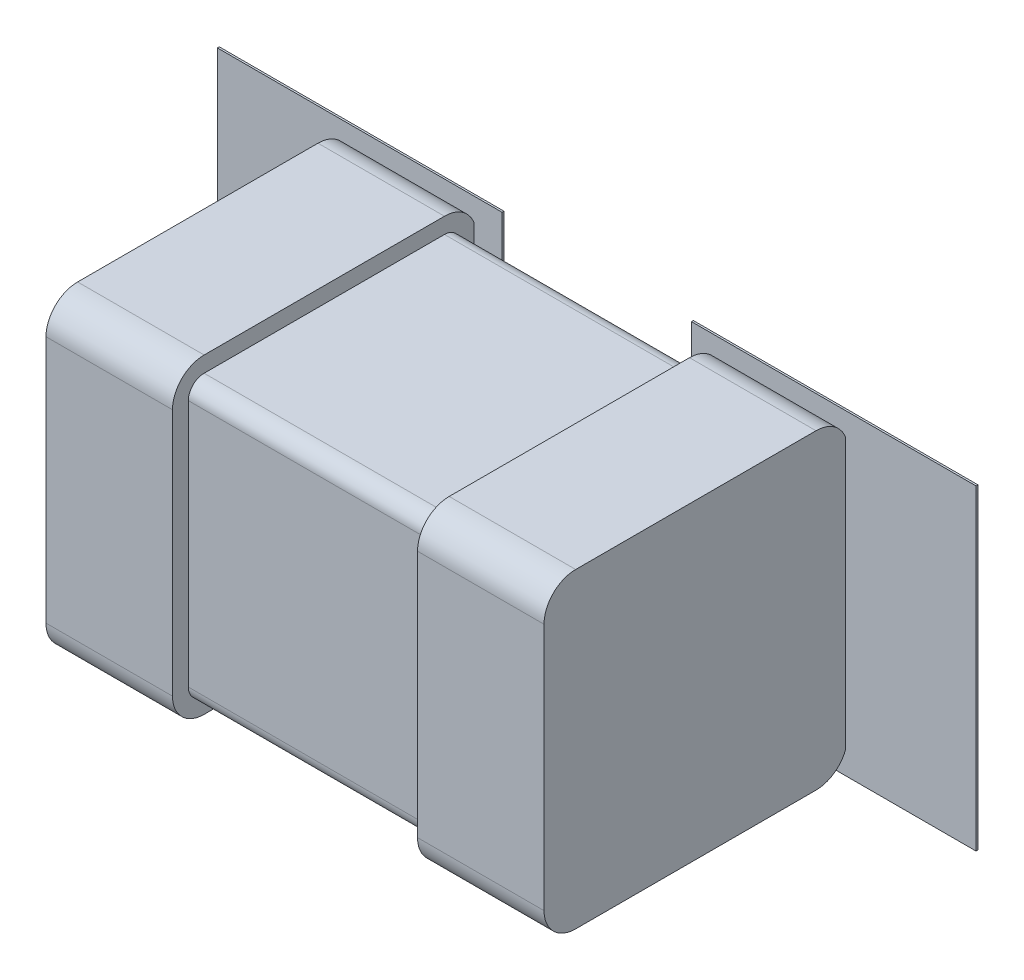
ISO-10303-21;
HEADER;
FILE_DESCRIPTION(('STEP AP214'),'2;1');
FILE_NAME('part.step','',(''),(''),'','','');
FILE_SCHEMA(('AUTOMOTIVE_DESIGN { 1 0 10303 214 1 1 1 1 }'));
ENDSEC;
DATA;
#1=APPLICATION_CONTEXT('core data for automotive mechanical design processes');
#2=APPLICATION_PROTOCOL_DEFINITION('international standard','automotive_design',2000,#1);
#3=PRODUCT_CONTEXT('',#1,'mechanical');
#4=PRODUCT('Part','Part','',(#3));
#5=PRODUCT_RELATED_PRODUCT_CATEGORY('part','',(#4));
#6=PRODUCT_DEFINITION_FORMATION('','',#4);
#7=PRODUCT_DEFINITION_CONTEXT('part definition',#1,'design');
#8=PRODUCT_DEFINITION('design','',#6,#7);
#9=PRODUCT_DEFINITION_SHAPE('','',#8);
#10=(LENGTH_UNIT() NAMED_UNIT(*) SI_UNIT(.MILLI.,.METRE.));
#11=(NAMED_UNIT(*) PLANE_ANGLE_UNIT() SI_UNIT($,.RADIAN.));
#12=(NAMED_UNIT(*) SI_UNIT($,.STERADIAN.) SOLID_ANGLE_UNIT());
#13=UNCERTAINTY_MEASURE_WITH_UNIT(LENGTH_MEASURE(1.E-05),#10,'distance_accuracy_value','');
#14=(GEOMETRIC_REPRESENTATION_CONTEXT(3) GLOBAL_UNCERTAINTY_ASSIGNED_CONTEXT((#13)) GLOBAL_UNIT_ASSIGNED_CONTEXT((#10,
#11,#12)) REPRESENTATION_CONTEXT('',''));
#15=CARTESIAN_POINT('',(0.,0.,0.));
#16=DIRECTION('',(0.,0.,1.));
#17=DIRECTION('',(1.,0.,0.));
#18=AXIS2_PLACEMENT_3D('',#15,#16,#17);
#19=CARTESIAN_POINT('',(0.,0.,0.0762));
#20=DIRECTION('',(0.,0.,1.));
#21=DIRECTION('',(1.,0.,0.));
#22=AXIS2_PLACEMENT_3D('',#19,#20,#21);
#23=PLANE('',#22);
#24=DIRECTION('',(0.,1.,0.));
#25=VECTOR('',#24,1.);
#26=CARTESIAN_POINT('',(0.380492,0.635,0.0762));
#27=LINE('',#26,#25);
#28=CARTESIAN_POINT('',(0.380492,0.635,0.0762));
#29=VERTEX_POINT('',#28);
#30=CARTESIAN_POINT('',(0.380492,-0.635,0.0762));
#31=VERTEX_POINT('',#30);
#32=EDGE_CURVE('E228',#29,#31,#27,.F.);
#33=ORIENTED_EDGE('',*,*,#32,.F.);
#34=DIRECTION('',(1.,0.,0.));
#35=VECTOR('',#34,1.);
#36=CARTESIAN_POINT('',(1.523492,0.635,0.0762));
#37=LINE('',#36,#35);
#38=CARTESIAN_POINT('',(1.523492,0.635,0.0762));
#39=VERTEX_POINT('',#38);
#40=EDGE_CURVE('E215',#39,#29,#37,.F.);
#41=ORIENTED_EDGE('',*,*,#40,.F.);
#42=DIRECTION('',(0.,1.,0.));
#43=VECTOR('',#42,1.);
#44=CARTESIAN_POINT('',(1.523492,-0.635,0.0762));
#45=LINE('',#44,#43);
#46=CARTESIAN_POINT('',(1.523492,-0.635,0.0762));
#47=VERTEX_POINT('',#46);
#48=EDGE_CURVE('E356',#47,#39,#45,.T.);
#49=ORIENTED_EDGE('',*,*,#48,.F.);
#50=DIRECTION('',(1.,0.,0.));
#51=VECTOR('',#50,1.);
#52=CARTESIAN_POINT('',(0.380492,-0.635,0.0762));
#53=LINE('',#52,#51);
#54=EDGE_CURVE('E229',#31,#47,#53,.T.);
#55=ORIENTED_EDGE('',*,*,#54,.F.);
#56=EDGE_LOOP('',(#33,#41,#49,#55));
#57=FACE_BOUND('',#56,.T.);
#58=ADVANCED_FACE('F16',(#57),#23,.F.);
#59=CARTESIAN_POINT('',(1.523492,0.635,0.0762));
#60=DIRECTION('',(0.,1.,0.));
#61=DIRECTION('',(0.,0.,1.));
#62=AXIS2_PLACEMENT_3D('',#59,#60,#61);
#63=PLANE('',#62);
#64=DIRECTION('',(0.,0.,-1.));
#65=VECTOR('',#64,1.);
#66=CARTESIAN_POINT('',(1.523492,0.635,0.0762));
#67=LINE('',#66,#65);
#68=CARTESIAN_POINT('',(1.523492,0.635,0.08382));
#69=VERTEX_POINT('',#68);
#70=EDGE_CURVE('E222',#39,#69,#67,.F.);
#71=ORIENTED_EDGE('',*,*,#70,.F.);
#72=ORIENTED_EDGE('',*,*,#40,.T.);
#73=DIRECTION('',(0.,0.,1.));
#74=VECTOR('',#73,1.);
#75=CARTESIAN_POINT('',(0.380492,0.635,0.0762));
#76=LINE('',#75,#74);
#77=CARTESIAN_POINT('',(0.380492,0.635,0.08382));
#78=VERTEX_POINT('',#77);
#79=EDGE_CURVE('E219',#78,#29,#76,.F.);
#80=ORIENTED_EDGE('',*,*,#79,.F.);
#81=DIRECTION('',(1.,0.,0.));
#82=VECTOR('',#81,1.);
#83=CARTESIAN_POINT('',(0.,0.635,0.08382));
#84=LINE('',#83,#82);
#85=EDGE_CURVE('E354',#69,#78,#84,.F.);
#86=ORIENTED_EDGE('',*,*,#85,.F.);
#87=EDGE_LOOP('',(#71,#72,#80,#86));
#88=FACE_BOUND('',#87,.T.);
#89=ADVANCED_FACE('F217',(#88),#63,.T.);
#90=CARTESIAN_POINT('',(0.380492,0.635,0.0762));
#91=DIRECTION('',(-1.,0.,0.));
#92=DIRECTION('',(0.,0.,1.));
#93=AXIS2_PLACEMENT_3D('',#90,#91,#92);
#94=PLANE('',#93);
#95=ORIENTED_EDGE('',*,*,#79,.T.);
#96=ORIENTED_EDGE('',*,*,#32,.T.);
#97=DIRECTION('',(0.,0.,-1.));
#98=VECTOR('',#97,1.);
#99=CARTESIAN_POINT('',(0.380492,-0.635,0.0762));
#100=LINE('',#99,#98);
#101=CARTESIAN_POINT('',(0.380492,-0.635,0.08382));
#102=VERTEX_POINT('',#101);
#103=EDGE_CURVE('E232',#102,#31,#100,.T.);
#104=ORIENTED_EDGE('',*,*,#103,.F.);
#105=DIRECTION('',(0.,1.,0.));
#106=VECTOR('',#105,1.);
#107=CARTESIAN_POINT('',(0.380492,0.,0.08382));
#108=LINE('',#107,#106);
#109=EDGE_CURVE('E236',#78,#102,#108,.F.);
#110=ORIENTED_EDGE('',*,*,#109,.F.);
#111=EDGE_LOOP('',(#95,#96,#104,#110));
#112=FACE_BOUND('',#111,.T.);
#113=ADVANCED_FACE('F234',(#112),#94,.T.);
#114=CARTESIAN_POINT('',(0.380492,-0.635,0.0762));
#115=DIRECTION('',(0.,-1.,0.));
#116=DIRECTION('',(0.,0.,-1.));
#117=AXIS2_PLACEMENT_3D('',#114,#115,#116);
#118=PLANE('',#117);
#119=ORIENTED_EDGE('',*,*,#103,.T.);
#120=ORIENTED_EDGE('',*,*,#54,.T.);
#121=DIRECTION('',(0.,0.,-1.));
#122=VECTOR('',#121,1.);
#123=CARTESIAN_POINT('',(1.523492,-0.635,0.0762));
#124=LINE('',#123,#122);
#125=CARTESIAN_POINT('',(1.523492,-0.635,0.08382));
#126=VERTEX_POINT('',#125);
#127=EDGE_CURVE('E191',#126,#47,#124,.T.);
#128=ORIENTED_EDGE('',*,*,#127,.F.);
#129=DIRECTION('',(1.,0.,0.));
#130=VECTOR('',#129,1.);
#131=CARTESIAN_POINT('',(0.,-0.635,0.08382));
#132=LINE('',#131,#130);
#133=EDGE_CURVE('E350',#102,#126,#132,.T.);
#134=ORIENTED_EDGE('',*,*,#133,.F.);
#135=EDGE_LOOP('',(#119,#120,#128,#134));
#136=FACE_BOUND('',#135,.T.);
#137=ADVANCED_FACE('F367',(#136),#118,.T.);
#138=CARTESIAN_POINT('',(1.523492,-0.635,0.0762));
#139=DIRECTION('',(1.,0.,0.));
#140=DIRECTION('',(0.,0.,-1.));
#141=AXIS2_PLACEMENT_3D('',#138,#139,#140);
#142=PLANE('',#141);
#143=ORIENTED_EDGE('',*,*,#127,.T.);
#144=ORIENTED_EDGE('',*,*,#48,.T.);
#145=ORIENTED_EDGE('',*,*,#70,.T.);
#146=DIRECTION('',(0.,1.,0.));
#147=VECTOR('',#146,1.);
#148=CARTESIAN_POINT('',(1.523492,0.,0.08382));
#149=LINE('',#148,#147);
#150=EDGE_CURVE('E347',#126,#69,#149,.T.);
#151=ORIENTED_EDGE('',*,*,#150,.F.);
#152=EDGE_LOOP('',(#143,#144,#145,#151));
#153=FACE_BOUND('',#152,.T.);
#154=ADVANCED_FACE('F371',(#153),#142,.T.);
#155=CARTESIAN_POINT('',(1.00000000000006,-0.62500000000004,0.0762));
#156=DIRECTION('',(1.,0.,0.));
#157=DIRECTION('',(0.,0.,-1.));
#158=AXIS2_PLACEMENT_3D('',#155,#156,#157);
#159=PLANE('',#158);
#160=CARTESIAN_POINT('',(1.00000000000006,-0.49800000000004,0.2032));
#161=DIRECTION('',(1.,0.,0.));
#162=DIRECTION('',(0.,0.,-1.));
#163=AXIS2_PLACEMENT_3D('',#160,#161,#162);
#164=CIRCLE('',#163,0.127);
#165=CARTESIAN_POINT('',(1.00000000000006,-0.541329154157453,0.083819999999987));
#166=VERTEX_POINT('',#165);
#167=CARTESIAN_POINT('',(1.00000000000006,-0.62500000000004,0.2032));
#168=VERTEX_POINT('',#167);
#169=EDGE_CURVE('E318',#166,#168,#164,.F.);
#170=ORIENTED_EDGE('',*,*,#169,.F.);
#171=DIRECTION('',(0.,1.,0.));
#172=VECTOR('',#171,1.);
#173=CARTESIAN_POINT('',(1.00000000000006,0.,0.08382));
#174=LINE('',#173,#172);
#175=CARTESIAN_POINT('',(1.00000000000006,0.541329154157453,0.083819999999987));
#176=VERTEX_POINT('',#175);
#177=EDGE_CURVE('E182',#176,#166,#174,.F.);
#178=ORIENTED_EDGE('',*,*,#177,.F.);
#179=CARTESIAN_POINT('',(1.00000000000006,0.49800000000004,0.2032));
#180=DIRECTION('',(1.,0.,0.));
#181=DIRECTION('',(0.,0.,-1.));
#182=AXIS2_PLACEMENT_3D('',#179,#180,#181);
#183=CIRCLE('',#182,0.127);
#184=CARTESIAN_POINT('',(1.00000000000006,0.62500000000004,0.2032));
#185=VERTEX_POINT('',#184);
#186=EDGE_CURVE('E19',#185,#176,#183,.F.);
#187=ORIENTED_EDGE('',*,*,#186,.F.);
#188=DIRECTION('',(0.,0.,1.));
#189=VECTOR('',#188,1.);
#190=CARTESIAN_POINT('',(1.00000000000006,0.62500000000004,0.0762));
#191=LINE('',#190,#189);
#192=CARTESIAN_POINT('',(1.00000000000006,0.62500000000004,1.1684));
#193=VERTEX_POINT('',#192);
#194=EDGE_CURVE('E336',#193,#185,#191,.F.);
#195=ORIENTED_EDGE('',*,*,#194,.F.);
#196=CARTESIAN_POINT('',(1.00000000000006,0.49800000000004,1.1684));
#197=DIRECTION('',(-1.,0.,0.));
#198=DIRECTION('',(0.,0.,1.));
#199=AXIS2_PLACEMENT_3D('',#196,#197,#198);
#200=CIRCLE('',#199,0.127);
#201=CARTESIAN_POINT('',(1.00000000000006,0.49800000000004,1.2954));
#202=VERTEX_POINT('',#201);
#203=EDGE_CURVE('E326',#202,#193,#200,.T.);
#204=ORIENTED_EDGE('',*,*,#203,.F.);
#205=DIRECTION('',(0.,1.,0.));
#206=VECTOR('',#205,1.);
#207=CARTESIAN_POINT('',(1.00000000000006,0.,1.2954));
#208=LINE('',#207,#206);
#209=CARTESIAN_POINT('',(1.00000000000006,-0.49800000000004,1.2954));
#210=VERTEX_POINT('',#209);
#211=EDGE_CURVE('E333',#210,#202,#208,.T.);
#212=ORIENTED_EDGE('',*,*,#211,.F.);
#213=CARTESIAN_POINT('',(1.00000000000006,-0.49800000000004,1.1684));
#214=DIRECTION('',(1.,0.,0.));
#215=DIRECTION('',(0.,0.,-1.));
#216=AXIS2_PLACEMENT_3D('',#213,#214,#215);
#217=CIRCLE('',#216,0.127);
#218=CARTESIAN_POINT('',(1.00000000000006,-0.62500000000004,1.1684));
#219=VERTEX_POINT('',#218);
#220=EDGE_CURVE('E322',#219,#210,#217,.F.);
#221=ORIENTED_EDGE('',*,*,#220,.F.);
#222=DIRECTION('',(0.,0.,-1.));
#223=VECTOR('',#222,1.);
#224=CARTESIAN_POINT('',(1.00000000000006,-0.62500000000004,0.0762));
#225=LINE('',#224,#223);
#226=EDGE_CURVE('E324',#168,#219,#225,.F.);
#227=ORIENTED_EDGE('',*,*,#226,.F.);
#228=EDGE_LOOP('',(#170,#178,#187,#195,#204,#212,#221,#227));
#229=FACE_BOUND('',#228,.T.);
#230=ADVANCED_FACE('F373',(#229),#159,.T.);
#231=CARTESIAN_POINT('',(0.,0.,0.08382));
#232=DIRECTION('',(0.,0.,1.));
#233=DIRECTION('',(1.,0.,0.));
#234=AXIS2_PLACEMENT_3D('',#231,#232,#233);
#235=PLANE('',#234);
#236=DIRECTION('',(1.,0.,0.));
#237=VECTOR('',#236,1.);
#238=CARTESIAN_POINT('',(1.00000000000006,0.541329154157417,0.083819999999974));
#239=LINE('',#238,#237);
#240=CARTESIAN_POINT('',(0.492000000000064,0.541329154157453,0.083819999999987));
#241=VERTEX_POINT('',#240);
#242=EDGE_CURVE('E344',#176,#241,#239,.F.);
#243=ORIENTED_EDGE('',*,*,#242,.F.);
#244=ORIENTED_EDGE('',*,*,#177,.T.);
#245=DIRECTION('',(1.,0.,0.));
#246=VECTOR('',#245,1.);
#247=CARTESIAN_POINT('',(1.00000000000006,-0.541329154157418,0.083819999999974));
#248=LINE('',#247,#246);
#249=CARTESIAN_POINT('',(0.492000000000064,-0.541329154157453,0.083819999999987));
#250=VERTEX_POINT('',#249);
#251=EDGE_CURVE('E321',#250,#166,#248,.T.);
#252=ORIENTED_EDGE('',*,*,#251,.F.);
#253=DIRECTION('',(0.,1.,0.));
#254=VECTOR('',#253,1.);
#255=CARTESIAN_POINT('',(0.492000000000064,0.56150000000004,0.0838200000000001));
#256=LINE('',#255,#254);
#257=EDGE_CURVE('E317',#250,#241,#256,.T.);
#258=ORIENTED_EDGE('',*,*,#257,.T.);
#259=EDGE_LOOP('',(#243,#244,#252,#258));
#260=FACE_BOUND('',#259,.T.);
#261=ORIENTED_EDGE('',*,*,#133,.T.);
#262=ORIENTED_EDGE('',*,*,#150,.T.);
#263=ORIENTED_EDGE('',*,*,#85,.T.);
#264=ORIENTED_EDGE('',*,*,#109,.T.);
#265=EDGE_LOOP('',(#261,#262,#263,#264));
#266=FACE_BOUND('',#265,.T.);
#267=ADVANCED_FACE('F369',(#260,#266),#235,.T.);
#268=CARTESIAN_POINT('',(1.00000000000006,0.49800000000004,0.2032));
#269=DIRECTION('',(1.,0.,0.));
#270=DIRECTION('',(0.,0.,-1.));
#271=AXIS2_PLACEMENT_3D('',#268,#269,#270);
#272=CYLINDRICAL_SURFACE('',#271,0.127);
#273=DIRECTION('',(1.,0.,0.));
#274=VECTOR('',#273,1.);
#275=CARTESIAN_POINT('',(1.00000000000006,0.62500000000004,0.2032));
#276=LINE('',#275,#274);
#277=CARTESIAN_POINT('',(0.492000000000064,0.62500000000004,0.2032));
#278=VERTEX_POINT('',#277);
#279=EDGE_CURVE('E329',#185,#278,#276,.F.);
#280=ORIENTED_EDGE('',*,*,#279,.F.);
#281=ORIENTED_EDGE('',*,*,#186,.T.);
#282=ORIENTED_EDGE('',*,*,#242,.T.);
#283=CARTESIAN_POINT('',(0.492000000000064,0.49800000000004,0.2032));
#284=DIRECTION('',(1.,0.,0.));
#285=DIRECTION('',(0.,0.,-1.));
#286=AXIS2_PLACEMENT_3D('',#283,#284,#285);
#287=CIRCLE('',#286,0.127);
#288=EDGE_CURVE('E315',#241,#278,#287,.T.);
#289=ORIENTED_EDGE('',*,*,#288,.T.);
#290=EDGE_LOOP('',(#280,#281,#282,#289));
#291=FACE_BOUND('',#290,.T.);
#292=ADVANCED_FACE('F502',(#291),#272,.T.);
#293=CARTESIAN_POINT('',(1.00000000000006,0.62500000000004,0.0762));
#294=DIRECTION('',(0.,1.,0.));
#295=DIRECTION('',(0.,0.,1.));
#296=AXIS2_PLACEMENT_3D('',#293,#294,#295);
#297=PLANE('',#296);
#298=ORIENTED_EDGE('',*,*,#194,.T.);
#299=ORIENTED_EDGE('',*,*,#279,.T.);
#300=DIRECTION('',(0.,0.,-1.));
#301=VECTOR('',#300,1.);
#302=CARTESIAN_POINT('',(0.492000000000064,0.62500000000004,1.2954));
#303=LINE('',#302,#301);
#304=CARTESIAN_POINT('',(0.492000000000064,0.62500000000004,1.1684));
#305=VERTEX_POINT('',#304);
#306=EDGE_CURVE('E314',#278,#305,#303,.F.);
#307=ORIENTED_EDGE('',*,*,#306,.T.);
#308=DIRECTION('',(-1.,0.,0.));
#309=VECTOR('',#308,1.);
#310=CARTESIAN_POINT('',(1.00524769062328,0.62500000000004,1.1684));
#311=LINE('',#310,#309);
#312=EDGE_CURVE('E328',#193,#305,#311,.T.);
#313=ORIENTED_EDGE('',*,*,#312,.F.);
#314=EDGE_LOOP('',(#298,#299,#307,#313));
#315=FACE_BOUND('',#314,.T.);
#316=ADVANCED_FACE('F499',(#315),#297,.T.);
#317=CARTESIAN_POINT('',(1.00524769062328,0.49800000000004,1.1684));
#318=DIRECTION('',(-1.,0.,0.));
#319=DIRECTION('',(0.,0.,1.));
#320=AXIS2_PLACEMENT_3D('',#317,#318,#319);
#321=CYLINDRICAL_SURFACE('',#320,0.127);
#322=ORIENTED_EDGE('',*,*,#312,.T.);
#323=CARTESIAN_POINT('',(0.492000000000064,0.49800000000004,1.1684));
#324=DIRECTION('',(-1.,0.,0.));
#325=DIRECTION('',(0.,0.,1.));
#326=AXIS2_PLACEMENT_3D('',#323,#324,#325);
#327=CIRCLE('',#326,0.127);
#328=CARTESIAN_POINT('',(0.492000000000064,0.49800000000004,1.2954));
#329=VERTEX_POINT('',#328);
#330=EDGE_CURVE('E312',#305,#329,#327,.F.);
#331=ORIENTED_EDGE('',*,*,#330,.T.);
#332=DIRECTION('',(1.,0.,0.));
#333=VECTOR('',#332,1.);
#334=CARTESIAN_POINT('',(0.,0.49800000000004,1.2954));
#335=LINE('',#334,#333);
#336=EDGE_CURVE('E362',#202,#329,#335,.F.);
#337=ORIENTED_EDGE('',*,*,#336,.F.);
#338=ORIENTED_EDGE('',*,*,#203,.T.);
#339=EDGE_LOOP('',(#322,#331,#337,#338));
#340=FACE_BOUND('',#339,.T.);
#341=ADVANCED_FACE('F495',(#340),#321,.T.);
#342=CARTESIAN_POINT('',(0.,0.,1.2954));
#343=DIRECTION('',(0.,0.,1.));
#344=DIRECTION('',(1.,0.,0.));
#345=AXIS2_PLACEMENT_3D('',#342,#343,#344);
#346=PLANE('',#345);
#347=ORIENTED_EDGE('',*,*,#211,.T.);
#348=ORIENTED_EDGE('',*,*,#336,.T.);
#349=DIRECTION('',(0.,1.,0.));
#350=VECTOR('',#349,1.);
#351=CARTESIAN_POINT('',(0.492000000000064,0.56150000000004,1.2954));
#352=LINE('',#351,#350);
#353=CARTESIAN_POINT('',(0.492000000000064,-0.49800000000004,1.2954));
#354=VERTEX_POINT('',#353);
#355=EDGE_CURVE('E311',#329,#354,#352,.F.);
#356=ORIENTED_EDGE('',*,*,#355,.T.);
#357=DIRECTION('',(1.,0.,0.));
#358=VECTOR('',#357,1.);
#359=CARTESIAN_POINT('',(-1.00545766639459,-0.49800000000004,1.2954));
#360=LINE('',#359,#358);
#361=EDGE_CURVE('E325',#210,#354,#360,.F.);
#362=ORIENTED_EDGE('',*,*,#361,.F.);
#363=EDGE_LOOP('',(#347,#348,#356,#362));
#364=FACE_BOUND('',#363,.T.);
#365=ADVANCED_FACE('F491',(#364),#346,.T.);
#366=CARTESIAN_POINT('',(-1.00545766639459,-0.49800000000004,1.1684));
#367=DIRECTION('',(1.,0.,0.));
#368=DIRECTION('',(0.,0.,-1.));
#369=AXIS2_PLACEMENT_3D('',#366,#367,#368);
#370=CYLINDRICAL_SURFACE('',#369,0.127);
#371=DIRECTION('',(1.,0.,0.));
#372=VECTOR('',#371,1.);
#373=CARTESIAN_POINT('',(-1.00000000000006,-0.62500000000004,1.1684));
#374=LINE('',#373,#372);
#375=CARTESIAN_POINT('',(0.492000000000064,-0.62500000000004,1.1684));
#376=VERTEX_POINT('',#375);
#377=EDGE_CURVE('E360',#219,#376,#374,.F.);
#378=ORIENTED_EDGE('',*,*,#377,.F.);
#379=ORIENTED_EDGE('',*,*,#220,.T.);
#380=ORIENTED_EDGE('',*,*,#361,.T.);
#381=CARTESIAN_POINT('',(0.492000000000064,-0.49800000000004,1.1684));
#382=DIRECTION('',(1.,0.,0.));
#383=DIRECTION('',(0.,0.,-1.));
#384=AXIS2_PLACEMENT_3D('',#381,#382,#383);
#385=CIRCLE('',#384,0.127);
#386=EDGE_CURVE('E309',#354,#376,#385,.T.);
#387=ORIENTED_EDGE('',*,*,#386,.T.);
#388=EDGE_LOOP('',(#378,#379,#380,#387));
#389=FACE_BOUND('',#388,.T.);
#390=ADVANCED_FACE('F487',(#389),#370,.T.);
#391=CARTESIAN_POINT('',(-1.00000000000006,-0.62500000000004,0.0762));
#392=DIRECTION('',(0.,-1.,0.));
#393=DIRECTION('',(0.,0.,-1.));
#394=AXIS2_PLACEMENT_3D('',#391,#392,#393);
#395=PLANE('',#394);
#396=DIRECTION('',(0.,0.,-1.));
#397=VECTOR('',#396,1.);
#398=CARTESIAN_POINT('',(0.492000000000064,-0.62500000000004,1.2954));
#399=LINE('',#398,#397);
#400=CARTESIAN_POINT('',(0.492000000000064,-0.62500000000004,0.2032));
#401=VERTEX_POINT('',#400);
#402=EDGE_CURVE('E308',#376,#401,#399,.T.);
#403=ORIENTED_EDGE('',*,*,#402,.T.);
#404=DIRECTION('',(1.,0.,0.));
#405=VECTOR('',#404,1.);
#406=CARTESIAN_POINT('',(1.00000000000006,-0.62500000000004,0.2032));
#407=LINE('',#406,#405);
#408=EDGE_CURVE('E525',#168,#401,#407,.F.);
#409=ORIENTED_EDGE('',*,*,#408,.F.);
#410=ORIENTED_EDGE('',*,*,#226,.T.);
#411=ORIENTED_EDGE('',*,*,#377,.T.);
#412=EDGE_LOOP('',(#403,#409,#410,#411));
#413=FACE_BOUND('',#412,.T.);
#414=ADVANCED_FACE('F483',(#413),#395,.T.);
#415=CARTESIAN_POINT('',(1.00000000000006,-0.49800000000004,0.2032));
#416=DIRECTION('',(1.,0.,0.));
#417=DIRECTION('',(0.,0.,-1.));
#418=AXIS2_PLACEMENT_3D('',#415,#416,#417);
#419=CYLINDRICAL_SURFACE('',#418,0.127);
#420=ORIENTED_EDGE('',*,*,#251,.T.);
#421=ORIENTED_EDGE('',*,*,#169,.T.);
#422=ORIENTED_EDGE('',*,*,#408,.T.);
#423=CARTESIAN_POINT('',(0.492000000000064,-0.49800000000004,0.2032));
#424=DIRECTION('',(1.,0.,0.));
#425=DIRECTION('',(0.,0.,-1.));
#426=AXIS2_PLACEMENT_3D('',#423,#424,#425);
#427=CIRCLE('',#426,0.127);
#428=EDGE_CURVE('E305',#401,#250,#427,.T.);
#429=ORIENTED_EDGE('',*,*,#428,.T.);
#430=EDGE_LOOP('',(#420,#421,#422,#429));
#431=FACE_BOUND('',#430,.T.);
#432=ADVANCED_FACE('F479',(#431),#419,.T.);
#433=CARTESIAN_POINT('',(0.492000000000064,0.56150000000004,1.2954));
#434=DIRECTION('',(1.,0.,0.));
#435=DIRECTION('',(0.,0.,-1.));
#436=AXIS2_PLACEMENT_3D('',#433,#434,#435);
#437=PLANE('',#436);
#438=DIRECTION('',(0.,0.,1.));
#439=VECTOR('',#438,1.);
#440=CARTESIAN_POINT('',(0.492000000000064,-0.56150000000004,1.2954));
#441=LINE('',#440,#439);
#442=CARTESIAN_POINT('',(0.492000000000064,-0.56150000000004,1.1684));
#443=VERTEX_POINT('',#442);
#444=CARTESIAN_POINT('',(0.492000000000064,-0.56150000000004,0.2032));
#445=VERTEX_POINT('',#444);
#446=EDGE_CURVE('E294',#443,#445,#441,.F.);
#447=ORIENTED_EDGE('',*,*,#446,.T.);
#448=CARTESIAN_POINT('',(0.492000000000064,-0.49800000000004,0.2032));
#449=DIRECTION('',(1.,0.,0.));
#450=DIRECTION('',(0.,0.,-1.));
#451=AXIS2_PLACEMENT_3D('',#448,#449,#450);
#452=CIRCLE('',#451,0.0635);
#453=CARTESIAN_POINT('',(0.492000000000064,-0.49800000000004,0.1397));
#454=VERTEX_POINT('',#453);
#455=EDGE_CURVE('E290',#454,#445,#452,.F.);
#456=ORIENTED_EDGE('',*,*,#455,.F.);
#457=DIRECTION('',(0.,1.,0.));
#458=VECTOR('',#457,1.);
#459=CARTESIAN_POINT('',(0.492000000000064,0.56150000000004,0.1397));
#460=LINE('',#459,#458);
#461=CARTESIAN_POINT('',(0.492000000000064,0.49800000000004,0.1397));
#462=VERTEX_POINT('',#461);
#463=EDGE_CURVE('E536',#454,#462,#460,.T.);
#464=ORIENTED_EDGE('',*,*,#463,.T.);
#465=CARTESIAN_POINT('',(0.492000000000064,0.49800000000004,0.2032));
#466=DIRECTION('',(-1.,0.,0.));
#467=DIRECTION('',(0.,0.,1.));
#468=AXIS2_PLACEMENT_3D('',#465,#466,#467);
#469=CIRCLE('',#468,0.0635);
#470=CARTESIAN_POINT('',(0.492000000000064,0.56150000000004,0.2032));
#471=VERTEX_POINT('',#470);
#472=EDGE_CURVE('E285',#471,#462,#469,.T.);
#473=ORIENTED_EDGE('',*,*,#472,.F.);
#474=DIRECTION('',(0.,0.,-1.));
#475=VECTOR('',#474,1.);
#476=CARTESIAN_POINT('',(0.492000000000064,0.56150000000004,1.2954));
#477=LINE('',#476,#475);
#478=CARTESIAN_POINT('',(0.492000000000064,0.56150000000004,1.1684));
#479=VERTEX_POINT('',#478);
#480=EDGE_CURVE('E304',#471,#479,#477,.F.);
#481=ORIENTED_EDGE('',*,*,#480,.T.);
#482=CARTESIAN_POINT('',(0.492000000000064,0.49800000000004,1.1684));
#483=DIRECTION('',(1.,0.,0.));
#484=DIRECTION('',(0.,0.,-1.));
#485=AXIS2_PLACEMENT_3D('',#482,#483,#484);
#486=CIRCLE('',#485,0.0635);
#487=CARTESIAN_POINT('',(0.492000000000064,0.49800000000004,1.2319));
#488=VERTEX_POINT('',#487);
#489=EDGE_CURVE('E300',#488,#479,#486,.F.);
#490=ORIENTED_EDGE('',*,*,#489,.F.);
#491=DIRECTION('',(0.,1.,0.));
#492=VECTOR('',#491,1.);
#493=CARTESIAN_POINT('',(0.492000000000064,0.56150000000004,1.2319));
#494=LINE('',#493,#492);
#495=CARTESIAN_POINT('',(0.492000000000064,-0.49800000000004,1.2319));
#496=VERTEX_POINT('',#495);
#497=EDGE_CURVE('E299',#488,#496,#494,.F.);
#498=ORIENTED_EDGE('',*,*,#497,.T.);
#499=CARTESIAN_POINT('',(0.492000000000064,-0.49800000000004,1.1684));
#500=DIRECTION('',(-1.,0.,0.));
#501=DIRECTION('',(0.,0.,1.));
#502=AXIS2_PLACEMENT_3D('',#499,#500,#501);
#503=CIRCLE('',#502,0.0635);
#504=EDGE_CURVE('E295',#443,#496,#503,.T.);
#505=ORIENTED_EDGE('',*,*,#504,.F.);
#506=EDGE_LOOP('',(#447,#456,#464,#473,#481,#490,#498,#505));
#507=FACE_BOUND('',#506,.T.);
#508=ORIENTED_EDGE('',*,*,#402,.F.);
#509=ORIENTED_EDGE('',*,*,#386,.F.);
#510=ORIENTED_EDGE('',*,*,#355,.F.);
#511=ORIENTED_EDGE('',*,*,#330,.F.);
#512=ORIENTED_EDGE('',*,*,#306,.F.);
#513=ORIENTED_EDGE('',*,*,#288,.F.);
#514=ORIENTED_EDGE('',*,*,#257,.F.);
#515=ORIENTED_EDGE('',*,*,#428,.F.);
#516=EDGE_LOOP('',(#508,#509,#510,#511,#512,#513,#514,#515));
#517=FACE_BOUND('',#516,.T.);
#518=ADVANCED_FACE('F475',(#507,#517),#437,.F.);
#519=CARTESIAN_POINT('',(0.,0.,0.0762));
#520=DIRECTION('',(0.,0.,1.));
#521=DIRECTION('',(1.,0.,0.));
#522=AXIS2_PLACEMENT_3D('',#519,#520,#521);
#523=PLANE('',#522);
#524=DIRECTION('',(0.,1.,0.));
#525=VECTOR('',#524,1.);
#526=CARTESIAN_POINT('',(-0.380492,-0.635,0.0762));
#527=LINE('',#526,#525);
#528=CARTESIAN_POINT('',(-0.380492,-0.635,0.0762));
#529=VERTEX_POINT('',#528);
#530=CARTESIAN_POINT('',(-0.380492,0.635,0.0762));
#531=VERTEX_POINT('',#530);
#532=EDGE_CURVE('E576',#529,#531,#527,.T.);
#533=ORIENTED_EDGE('',*,*,#532,.F.);
#534=DIRECTION('',(1.,0.,0.));
#535=VECTOR('',#534,1.);
#536=CARTESIAN_POINT('',(-1.523492,-0.635,0.0762));
#537=LINE('',#536,#535);
#538=CARTESIAN_POINT('',(-1.523492,-0.635,0.0762));
#539=VERTEX_POINT('',#538);
#540=EDGE_CURVE('E564',#539,#529,#537,.T.);
#541=ORIENTED_EDGE('',*,*,#540,.F.);
#542=DIRECTION('',(0.,1.,0.));
#543=VECTOR('',#542,1.);
#544=CARTESIAN_POINT('',(-1.523492,0.635,0.0762));
#545=LINE('',#544,#543);
#546=CARTESIAN_POINT('',(-1.523492,0.635,0.0762));
#547=VERTEX_POINT('',#546);
#548=EDGE_CURVE('E591',#547,#539,#545,.F.);
#549=ORIENTED_EDGE('',*,*,#548,.F.);
#550=DIRECTION('',(1.,0.,0.));
#551=VECTOR('',#550,1.);
#552=CARTESIAN_POINT('',(-0.380492,0.635,0.0762));
#553=LINE('',#552,#551);
#554=EDGE_CURVE('E582',#531,#547,#553,.F.);
#555=ORIENTED_EDGE('',*,*,#554,.F.);
#556=EDGE_LOOP('',(#533,#541,#549,#555));
#557=FACE_BOUND('',#556,.T.);
#558=ADVANCED_FACE('F471',(#557),#523,.F.);
#559=CARTESIAN_POINT('',(-0.492000000000064,0.56150000000004,1.2954));
#560=DIRECTION('',(0.,-1.,0.));
#561=DIRECTION('',(0.,0.,-1.));
#562=AXIS2_PLACEMENT_3D('',#559,#560,#561);
#563=PLANE('',#562);
#564=DIRECTION('',(1.,0.,0.));
#565=VECTOR('',#564,1.);
#566=CARTESIAN_POINT('',(-0.49772088145871,0.56150000000004,1.1684));
#567=LINE('',#566,#565);
#568=CARTESIAN_POINT('',(-0.492000000000064,0.56150000000004,1.1684));
#569=VERTEX_POINT('',#568);
#570=EDGE_CURVE('E303',#479,#569,#567,.F.);
#571=ORIENTED_EDGE('',*,*,#570,.F.);
#572=ORIENTED_EDGE('',*,*,#480,.F.);
#573=DIRECTION('',(-1.,0.,0.));
#574=VECTOR('',#573,1.);
#575=CARTESIAN_POINT('',(0.49724769062328,0.56150000000004,0.2032));
#576=LINE('',#575,#574);
#577=CARTESIAN_POINT('',(-0.492000000000064,0.56150000000004,0.2032));
#578=VERTEX_POINT('',#577);
#579=EDGE_CURVE('E289',#578,#471,#576,.F.);
#580=ORIENTED_EDGE('',*,*,#579,.F.);
#581=DIRECTION('',(0.,0.,1.));
#582=VECTOR('',#581,1.);
#583=CARTESIAN_POINT('',(-0.492000000000064,0.56150000000004,1.2954));
#584=LINE('',#583,#582);
#585=EDGE_CURVE('E284',#578,#569,#584,.T.);
#586=ORIENTED_EDGE('',*,*,#585,.T.);
#587=EDGE_LOOP('',(#571,#572,#580,#586));
#588=FACE_BOUND('',#587,.T.);
#589=ADVANCED_FACE('F467',(#588),#563,.F.);
#590=CARTESIAN_POINT('',(-0.49772088145871,0.49800000000004,1.1684));
#591=DIRECTION('',(1.,0.,0.));
#592=DIRECTION('',(0.,0.,-1.));
#593=AXIS2_PLACEMENT_3D('',#590,#591,#592);
#594=CYLINDRICAL_SURFACE('',#593,0.0635);
#595=CARTESIAN_POINT('',(-0.492000000000064,0.49800000000004,1.1684));
#596=DIRECTION('',(1.,0.,0.));
#597=DIRECTION('',(0.,0.,-1.));
#598=AXIS2_PLACEMENT_3D('',#595,#596,#597);
#599=CIRCLE('',#598,0.0635);
#600=CARTESIAN_POINT('',(-0.492000000000064,0.49800000000004,1.2319));
#601=VERTEX_POINT('',#600);
#602=EDGE_CURVE('E282',#569,#601,#599,.T.);
#603=ORIENTED_EDGE('',*,*,#602,.T.);
#604=DIRECTION('',(-1.,0.,0.));
#605=VECTOR('',#604,1.);
#606=CARTESIAN_POINT('',(0.492000000000064,0.49800000000004,1.2319));
#607=LINE('',#606,#605);
#608=EDGE_CURVE('E543',#601,#488,#607,.F.);
#609=ORIENTED_EDGE('',*,*,#608,.T.);
#610=ORIENTED_EDGE('',*,*,#489,.T.);
#611=ORIENTED_EDGE('',*,*,#570,.T.);
#612=EDGE_LOOP('',(#603,#609,#610,#611));
#613=FACE_BOUND('',#612,.T.);
#614=ADVANCED_FACE('F463',(#613),#594,.T.);
#615=CARTESIAN_POINT('',(0.492000000000064,0.56150000000004,1.2319));
#616=DIRECTION('',(0.,0.,-1.));
#617=DIRECTION('',(-1.,0.,0.));
#618=AXIS2_PLACEMENT_3D('',#615,#616,#617);
#619=PLANE('',#618);
#620=DIRECTION('',(-1.,0.,0.));
#621=VECTOR('',#620,1.);
#622=CARTESIAN_POINT('',(0.49745766639459,-0.49800000000004,1.2319));
#623=LINE('',#622,#621);
#624=CARTESIAN_POINT('',(-0.492000000000064,-0.49800000000004,1.2319));
#625=VERTEX_POINT('',#624);
#626=EDGE_CURVE('E298',#496,#625,#623,.T.);
#627=ORIENTED_EDGE('',*,*,#626,.F.);
#628=ORIENTED_EDGE('',*,*,#497,.F.);
#629=ORIENTED_EDGE('',*,*,#608,.F.);
#630=DIRECTION('',(0.,1.,0.));
#631=VECTOR('',#630,1.);
#632=CARTESIAN_POINT('',(-0.492000000000064,0.62500000000004,1.2319));
#633=LINE('',#632,#631);
#634=EDGE_CURVE('E281',#601,#625,#633,.F.);
#635=ORIENTED_EDGE('',*,*,#634,.T.);
#636=EDGE_LOOP('',(#627,#628,#629,#635));
#637=FACE_BOUND('',#636,.T.);
#638=ADVANCED_FACE('F459',(#637),#619,.F.);
#639=CARTESIAN_POINT('',(0.49745766639459,-0.49800000000004,1.1684));
#640=DIRECTION('',(-1.,0.,0.));
#641=DIRECTION('',(0.,0.,1.));
#642=AXIS2_PLACEMENT_3D('',#639,#640,#641);
#643=CYLINDRICAL_SURFACE('',#642,0.0635);
#644=ORIENTED_EDGE('',*,*,#504,.T.);
#645=ORIENTED_EDGE('',*,*,#626,.T.);
#646=CARTESIAN_POINT('',(-0.492000000000064,-0.49800000000004,1.1684));
#647=DIRECTION('',(-1.,0.,0.));
#648=DIRECTION('',(0.,0.,1.));
#649=AXIS2_PLACEMENT_3D('',#646,#647,#648);
#650=CIRCLE('',#649,0.0635);
#651=CARTESIAN_POINT('',(-0.492000000000064,-0.56150000000004,1.1684));
#652=VERTEX_POINT('',#651);
#653=EDGE_CURVE('E279',#625,#652,#650,.F.);
#654=ORIENTED_EDGE('',*,*,#653,.T.);
#655=DIRECTION('',(1.,0.,0.));
#656=VECTOR('',#655,1.);
#657=CARTESIAN_POINT('',(0.492000000000064,-0.56150000000004,1.1684));
#658=LINE('',#657,#656);
#659=EDGE_CURVE('E542',#652,#443,#658,.T.);
#660=ORIENTED_EDGE('',*,*,#659,.T.);
#661=EDGE_LOOP('',(#644,#645,#654,#660));
#662=FACE_BOUND('',#661,.T.);
#663=ADVANCED_FACE('F455',(#662),#643,.T.);
#664=CARTESIAN_POINT('',(0.492000000000064,-0.56150000000004,1.2954));
#665=DIRECTION('',(0.,1.,0.));
#666=DIRECTION('',(0.,0.,1.));
#667=AXIS2_PLACEMENT_3D('',#664,#665,#666);
#668=PLANE('',#667);
#669=DIRECTION('',(1.,0.,0.));
#670=VECTOR('',#669,1.);
#671=CARTESIAN_POINT('',(-0.49724769062328,-0.56150000000004,0.2032));
#672=LINE('',#671,#670);
#673=CARTESIAN_POINT('',(-0.492000000000064,-0.56150000000004,0.2032));
#674=VERTEX_POINT('',#673);
#675=EDGE_CURVE('E293',#445,#674,#672,.F.);
#676=ORIENTED_EDGE('',*,*,#675,.F.);
#677=ORIENTED_EDGE('',*,*,#446,.F.);
#678=ORIENTED_EDGE('',*,*,#659,.F.);
#679=DIRECTION('',(0.,0.,1.));
#680=VECTOR('',#679,1.);
#681=CARTESIAN_POINT('',(-0.492000000000064,-0.56150000000004,1.2954));
#682=LINE('',#681,#680);
#683=EDGE_CURVE('E278',#652,#674,#682,.F.);
#684=ORIENTED_EDGE('',*,*,#683,.T.);
#685=EDGE_LOOP('',(#676,#677,#678,#684));
#686=FACE_BOUND('',#685,.T.);
#687=ADVANCED_FACE('F451',(#686),#668,.F.);
#688=CARTESIAN_POINT('',(-0.49724769062328,-0.49800000000004,0.2032));
#689=DIRECTION('',(1.,0.,0.));
#690=DIRECTION('',(0.,0.,-1.));
#691=AXIS2_PLACEMENT_3D('',#688,#689,#690);
#692=CYLINDRICAL_SURFACE('',#691,0.0635);
#693=CARTESIAN_POINT('',(-0.492000000000064,-0.49800000000004,0.2032));
#694=DIRECTION('',(1.,0.,0.));
#695=DIRECTION('',(0.,0.,-1.));
#696=AXIS2_PLACEMENT_3D('',#693,#694,#695);
#697=CIRCLE('',#696,0.0635);
#698=CARTESIAN_POINT('',(-0.492000000000064,-0.49800000000004,0.1397));
#699=VERTEX_POINT('',#698);
#700=EDGE_CURVE('E276',#674,#699,#697,.T.);
#701=ORIENTED_EDGE('',*,*,#700,.T.);
#702=DIRECTION('',(1.,0.,0.));
#703=VECTOR('',#702,1.);
#704=CARTESIAN_POINT('',(-0.492000000000064,-0.49800000000004,0.1397));
#705=LINE('',#704,#703);
#706=EDGE_CURVE('E557',#699,#454,#705,.T.);
#707=ORIENTED_EDGE('',*,*,#706,.T.);
#708=ORIENTED_EDGE('',*,*,#455,.T.);
#709=ORIENTED_EDGE('',*,*,#675,.T.);
#710=EDGE_LOOP('',(#701,#707,#708,#709));
#711=FACE_BOUND('',#710,.T.);
#712=ADVANCED_FACE('F447',(#711),#692,.T.);
#713=CARTESIAN_POINT('',(-0.492000000000064,0.56150000000004,0.1397));
#714=DIRECTION('',(0.,0.,1.));
#715=DIRECTION('',(1.,0.,0.));
#716=AXIS2_PLACEMENT_3D('',#713,#714,#715);
#717=PLANE('',#716);
#718=ORIENTED_EDGE('',*,*,#706,.F.);
#719=DIRECTION('',(0.,1.,0.));
#720=VECTOR('',#719,1.);
#721=CARTESIAN_POINT('',(-0.492000000000064,0.62500000000004,0.1397));
#722=LINE('',#721,#720);
#723=CARTESIAN_POINT('',(-0.492000000000064,0.49800000000004,0.1397));
#724=VERTEX_POINT('',#723);
#725=EDGE_CURVE('E275',#699,#724,#722,.T.);
#726=ORIENTED_EDGE('',*,*,#725,.T.);
#727=DIRECTION('',(-1.,0.,0.));
#728=VECTOR('',#727,1.);
#729=CARTESIAN_POINT('',(0.49724769062328,0.49800000000004,0.1397));
#730=LINE('',#729,#728);
#731=EDGE_CURVE('E288',#462,#724,#730,.T.);
#732=ORIENTED_EDGE('',*,*,#731,.F.);
#733=ORIENTED_EDGE('',*,*,#463,.F.);
#734=EDGE_LOOP('',(#718,#726,#732,#733));
#735=FACE_BOUND('',#734,.T.);
#736=ADVANCED_FACE('F443',(#735),#717,.F.);
#737=CARTESIAN_POINT('',(0.49724769062328,0.49800000000004,0.2032));
#738=DIRECTION('',(-1.,0.,0.));
#739=DIRECTION('',(0.,0.,1.));
#740=AXIS2_PLACEMENT_3D('',#737,#738,#739);
#741=CYLINDRICAL_SURFACE('',#740,0.0635);
#742=ORIENTED_EDGE('',*,*,#472,.T.);
#743=ORIENTED_EDGE('',*,*,#731,.T.);
#744=CARTESIAN_POINT('',(-0.492000000000064,0.49800000000004,0.2032));
#745=DIRECTION('',(-1.,0.,0.));
#746=DIRECTION('',(0.,0.,1.));
#747=AXIS2_PLACEMENT_3D('',#744,#745,#746);
#748=CIRCLE('',#747,0.0635);
#749=EDGE_CURVE('E272',#724,#578,#748,.F.);
#750=ORIENTED_EDGE('',*,*,#749,.T.);
#751=ORIENTED_EDGE('',*,*,#579,.T.);
#752=EDGE_LOOP('',(#742,#743,#750,#751));
#753=FACE_BOUND('',#752,.T.);
#754=ADVANCED_FACE('F439',(#753),#741,.T.);
#755=CARTESIAN_POINT('',(-1.523492,-0.635,0.0762));
#756=DIRECTION('',(0.,-1.,0.));
#757=DIRECTION('',(0.,0.,-1.));
#758=AXIS2_PLACEMENT_3D('',#755,#756,#757);
#759=PLANE('',#758);
#760=DIRECTION('',(0.,0.,1.));
#761=VECTOR('',#760,1.);
#762=CARTESIAN_POINT('',(-1.523492,-0.635,0.0762));
#763=LINE('',#762,#761);
#764=CARTESIAN_POINT('',(-1.523492,-0.635,0.08382));
#765=VERTEX_POINT('',#764);
#766=EDGE_CURVE('E585',#539,#765,#763,.T.);
#767=ORIENTED_EDGE('',*,*,#766,.F.);
#768=ORIENTED_EDGE('',*,*,#540,.T.);
#769=DIRECTION('',(0.,0.,-1.));
#770=VECTOR('',#769,1.);
#771=CARTESIAN_POINT('',(-0.380492,-0.635,0.0762));
#772=LINE('',#771,#770);
#773=CARTESIAN_POINT('',(-0.380492,-0.635,0.08382));
#774=VERTEX_POINT('',#773);
#775=EDGE_CURVE('E573',#774,#529,#772,.T.);
#776=ORIENTED_EDGE('',*,*,#775,.F.);
#777=DIRECTION('',(1.,0.,0.));
#778=VECTOR('',#777,1.);
#779=CARTESIAN_POINT('',(0.,-0.635,0.08382));
#780=LINE('',#779,#778);
#781=EDGE_CURVE('E258',#765,#774,#780,.T.);
#782=ORIENTED_EDGE('',*,*,#781,.F.);
#783=EDGE_LOOP('',(#767,#768,#776,#782));
#784=FACE_BOUND('',#783,.T.);
#785=ADVANCED_FACE('F435',(#784),#759,.T.);
#786=CARTESIAN_POINT('',(-0.380492,-0.635,0.0762));
#787=DIRECTION('',(1.,0.,0.));
#788=DIRECTION('',(0.,0.,-1.));
#789=AXIS2_PLACEMENT_3D('',#786,#787,#788);
#790=PLANE('',#789);
#791=ORIENTED_EDGE('',*,*,#775,.T.);
#792=ORIENTED_EDGE('',*,*,#532,.T.);
#793=DIRECTION('',(0.,0.,1.));
#794=VECTOR('',#793,1.);
#795=CARTESIAN_POINT('',(-0.380492,0.635,0.0762));
#796=LINE('',#795,#794);
#797=CARTESIAN_POINT('',(-0.380492,0.635,0.08382));
#798=VERTEX_POINT('',#797);
#799=EDGE_CURVE('E579',#798,#531,#796,.F.);
#800=ORIENTED_EDGE('',*,*,#799,.F.);
#801=DIRECTION('',(0.,1.,0.));
#802=VECTOR('',#801,1.);
#803=CARTESIAN_POINT('',(-0.380492,0.,0.08382));
#804=LINE('',#803,#802);
#805=EDGE_CURVE('E619',#774,#798,#804,.T.);
#806=ORIENTED_EDGE('',*,*,#805,.F.);
#807=EDGE_LOOP('',(#791,#792,#800,#806));
#808=FACE_BOUND('',#807,.T.);
#809=ADVANCED_FACE('F431',(#808),#790,.T.);
#810=CARTESIAN_POINT('',(-0.380492,0.635,0.0762));
#811=DIRECTION('',(0.,1.,0.));
#812=DIRECTION('',(0.,0.,1.));
#813=AXIS2_PLACEMENT_3D('',#810,#811,#812);
#814=PLANE('',#813);
#815=ORIENTED_EDGE('',*,*,#799,.T.);
#816=ORIENTED_EDGE('',*,*,#554,.T.);
#817=DIRECTION('',(0.,0.,1.));
#818=VECTOR('',#817,1.);
#819=CARTESIAN_POINT('',(-1.523492,0.635,0.0762));
#820=LINE('',#819,#818);
#821=CARTESIAN_POINT('',(-1.523492,0.635,0.08382));
#822=VERTEX_POINT('',#821);
#823=EDGE_CURVE('E588',#822,#547,#820,.F.);
#824=ORIENTED_EDGE('',*,*,#823,.F.);
#825=DIRECTION('',(1.,0.,0.));
#826=VECTOR('',#825,1.);
#827=CARTESIAN_POINT('',(0.,0.635,0.08382));
#828=LINE('',#827,#826);
#829=EDGE_CURVE('E622',#798,#822,#828,.F.);
#830=ORIENTED_EDGE('',*,*,#829,.F.);
#831=EDGE_LOOP('',(#815,#816,#824,#830));
#832=FACE_BOUND('',#831,.T.);
#833=ADVANCED_FACE('F427',(#832),#814,.T.);
#834=CARTESIAN_POINT('',(-1.523492,0.635,0.0762));
#835=DIRECTION('',(-1.,0.,0.));
#836=DIRECTION('',(0.,0.,1.));
#837=AXIS2_PLACEMENT_3D('',#834,#835,#836);
#838=PLANE('',#837);
#839=ORIENTED_EDGE('',*,*,#823,.T.);
#840=ORIENTED_EDGE('',*,*,#548,.T.);
#841=ORIENTED_EDGE('',*,*,#766,.T.);
#842=DIRECTION('',(0.,1.,0.));
#843=VECTOR('',#842,1.);
#844=CARTESIAN_POINT('',(-1.523492,0.,0.08382));
#845=LINE('',#844,#843);
#846=EDGE_CURVE('E616',#822,#765,#845,.F.);
#847=ORIENTED_EDGE('',*,*,#846,.F.);
#848=EDGE_LOOP('',(#839,#840,#841,#847));
#849=FACE_BOUND('',#848,.T.);
#850=ADVANCED_FACE('F423',(#849),#838,.T.);
#851=CARTESIAN_POINT('',(-0.492000000000064,0.62500000000004,1.2954));
#852=DIRECTION('',(-1.,0.,0.));
#853=DIRECTION('',(0.,0.,1.));
#854=AXIS2_PLACEMENT_3D('',#851,#852,#853);
#855=PLANE('',#854);
#856=ORIENTED_EDGE('',*,*,#725,.F.);
#857=ORIENTED_EDGE('',*,*,#700,.F.);
#858=ORIENTED_EDGE('',*,*,#683,.F.);
#859=ORIENTED_EDGE('',*,*,#653,.F.);
#860=ORIENTED_EDGE('',*,*,#634,.F.);
#861=ORIENTED_EDGE('',*,*,#602,.F.);
#862=ORIENTED_EDGE('',*,*,#585,.F.);
#863=ORIENTED_EDGE('',*,*,#749,.F.);
#864=EDGE_LOOP('',(#856,#857,#858,#859,#860,#861,#862,#863));
#865=FACE_BOUND('',#864,.T.);
#866=DIRECTION('',(0.,0.,1.));
#867=VECTOR('',#866,1.);
#868=CARTESIAN_POINT('',(-0.492000000000064,0.62500000000004,0.0762));
#869=LINE('',#868,#867);
#870=CARTESIAN_POINT('',(-0.492000000000064,0.62500000000004,1.1684));
#871=VERTEX_POINT('',#870);
#872=CARTESIAN_POINT('',(-0.492000000000064,0.62500000000004,0.2032));
#873=VERTEX_POINT('',#872);
#874=EDGE_CURVE('E569',#871,#873,#869,.F.);
#875=ORIENTED_EDGE('',*,*,#874,.F.);
#876=CARTESIAN_POINT('',(-0.492000000000064,0.49800000000004,1.1684));
#877=DIRECTION('',(-1.,0.,0.));
#878=DIRECTION('',(0.,0.,1.));
#879=AXIS2_PLACEMENT_3D('',#876,#877,#878);
#880=CIRCLE('',#879,0.127);
#881=CARTESIAN_POINT('',(-0.492000000000064,0.49800000000004,1.2954));
#882=VERTEX_POINT('',#881);
#883=EDGE_CURVE('E260',#882,#871,#880,.T.);
#884=ORIENTED_EDGE('',*,*,#883,.F.);
#885=DIRECTION('',(0.,1.,0.));
#886=VECTOR('',#885,1.);
#887=CARTESIAN_POINT('',(-0.492000000000064,0.,1.2954));
#888=LINE('',#887,#886);
#889=CARTESIAN_POINT('',(-0.492000000000064,-0.49800000000004,1.2954));
#890=VERTEX_POINT('',#889);
#891=EDGE_CURVE('E567',#890,#882,#888,.T.);
#892=ORIENTED_EDGE('',*,*,#891,.F.);
#893=CARTESIAN_POINT('',(-0.492000000000064,-0.49800000000004,1.1684));
#894=DIRECTION('',(1.,0.,0.));
#895=DIRECTION('',(0.,0.,-1.));
#896=AXIS2_PLACEMENT_3D('',#893,#894,#895);
#897=CIRCLE('',#896,0.127);
#898=CARTESIAN_POINT('',(-0.492000000000064,-0.62500000000004,1.1684));
#899=VERTEX_POINT('',#898);
#900=EDGE_CURVE('E264',#899,#890,#897,.F.);
#901=ORIENTED_EDGE('',*,*,#900,.F.);
#902=DIRECTION('',(0.,0.,-1.));
#903=VECTOR('',#902,1.);
#904=CARTESIAN_POINT('',(-0.492000000000064,-0.62500000000004,0.0762));
#905=LINE('',#904,#903);
#906=CARTESIAN_POINT('',(-0.492000000000064,-0.62500000000004,0.2032));
#907=VERTEX_POINT('',#906);
#908=EDGE_CURVE('E271',#907,#899,#905,.F.);
#909=ORIENTED_EDGE('',*,*,#908,.F.);
#910=CARTESIAN_POINT('',(-0.492000000000064,-0.49800000000004,0.2032));
#911=DIRECTION('',(1.,0.,0.));
#912=DIRECTION('',(0.,0.,-1.));
#913=AXIS2_PLACEMENT_3D('',#910,#911,#912);
#914=CIRCLE('',#913,0.127);
#915=CARTESIAN_POINT('',(-0.492000000000064,-0.541329154157449,0.08382));
#916=VERTEX_POINT('',#915);
#917=EDGE_CURVE('E268',#916,#907,#914,.F.);
#918=ORIENTED_EDGE('',*,*,#917,.F.);
#919=DIRECTION('',(0.,1.,0.));
#920=VECTOR('',#919,1.);
#921=CARTESIAN_POINT('',(-0.492000000000064,0.,0.08382));
#922=LINE('',#921,#920);
#923=CARTESIAN_POINT('',(-0.492000000000064,0.541329154157449,0.08382));
#924=VERTEX_POINT('',#923);
#925=EDGE_CURVE('E598',#924,#916,#922,.F.);
#926=ORIENTED_EDGE('',*,*,#925,.F.);
#927=CARTESIAN_POINT('',(-0.492000000000064,0.49800000000004,0.2032));
#928=DIRECTION('',(1.,0.,0.));
#929=DIRECTION('',(0.,0.,-1.));
#930=AXIS2_PLACEMENT_3D('',#927,#928,#929);
#931=CIRCLE('',#930,0.127);
#932=EDGE_CURVE('E256',#873,#924,#931,.F.);
#933=ORIENTED_EDGE('',*,*,#932,.F.);
#934=EDGE_LOOP('',(#875,#884,#892,#901,#909,#918,#926,#933));
#935=FACE_BOUND('',#934,.T.);
#936=ADVANCED_FACE('F419',(#865,#935),#855,.F.);
#937=CARTESIAN_POINT('',(1.00000000000006,-0.49800000000004,0.2032));
#938=DIRECTION('',(1.,0.,0.));
#939=DIRECTION('',(0.,0.,-1.));
#940=AXIS2_PLACEMENT_3D('',#937,#938,#939);
#941=CYLINDRICAL_SURFACE('',#940,0.127);
#942=DIRECTION('',(1.,0.,0.));
#943=VECTOR('',#942,1.);
#944=CARTESIAN_POINT('',(-1.00000000000006,-0.62500000000004,0.2032));
#945=LINE('',#944,#943);
#946=CARTESIAN_POINT('',(-1.00000000000006,-0.62500000000004,0.2032));
#947=VERTEX_POINT('',#946);
#948=EDGE_CURVE('E566',#947,#907,#945,.T.);
#949=ORIENTED_EDGE('',*,*,#948,.F.);
#950=CARTESIAN_POINT('',(-1.00000000000006,-0.49800000000004,0.2032));
#951=DIRECTION('',(1.,0.,0.));
#952=DIRECTION('',(0.,0.,-1.));
#953=AXIS2_PLACEMENT_3D('',#950,#951,#952);
#954=CIRCLE('',#953,0.127);
#955=CARTESIAN_POINT('',(-1.00000000000006,-0.541329154157449,0.08382));
#956=VERTEX_POINT('',#955);
#957=EDGE_CURVE('E252',#956,#947,#954,.F.);
#958=ORIENTED_EDGE('',*,*,#957,.F.);
#959=DIRECTION('',(1.,0.,0.));
#960=VECTOR('',#959,1.);
#961=CARTESIAN_POINT('',(0.,-0.541329154157408,0.08382));
#962=LINE('',#961,#960);
#963=EDGE_CURVE('E255',#916,#956,#962,.F.);
#964=ORIENTED_EDGE('',*,*,#963,.F.);
#965=ORIENTED_EDGE('',*,*,#917,.T.);
#966=EDGE_LOOP('',(#949,#958,#964,#965));
#967=FACE_BOUND('',#966,.T.);
#968=ADVANCED_FACE('F415',(#967),#941,.T.);
#969=CARTESIAN_POINT('',(-1.00000000000006,-0.62500000000004,0.0762));
#970=DIRECTION('',(0.,-1.,0.));
#971=DIRECTION('',(0.,0.,-1.));
#972=AXIS2_PLACEMENT_3D('',#969,#970,#971);
#973=PLANE('',#972);
#974=DIRECTION('',(0.,0.,1.));
#975=VECTOR('',#974,1.);
#976=CARTESIAN_POINT('',(-1.00000000000006,-0.62500000000004,0.0762));
#977=LINE('',#976,#975);
#978=CARTESIAN_POINT('',(-1.00000000000006,-0.62500000000004,1.1684));
#979=VERTEX_POINT('',#978);
#980=EDGE_CURVE('E251',#947,#979,#977,.T.);
#981=ORIENTED_EDGE('',*,*,#980,.F.);
#982=ORIENTED_EDGE('',*,*,#948,.T.);
#983=ORIENTED_EDGE('',*,*,#908,.T.);
#984=DIRECTION('',(1.,0.,0.));
#985=VECTOR('',#984,1.);
#986=CARTESIAN_POINT('',(-1.00545766639459,-0.62500000000004,1.1684));
#987=LINE('',#986,#985);
#988=EDGE_CURVE('E267',#979,#899,#987,.T.);
#989=ORIENTED_EDGE('',*,*,#988,.F.);
#990=EDGE_LOOP('',(#981,#982,#983,#989));
#991=FACE_BOUND('',#990,.T.);
#992=ADVANCED_FACE('F411',(#991),#973,.T.);
#993=CARTESIAN_POINT('',(-1.00545766639459,-0.49800000000004,1.1684));
#994=DIRECTION('',(1.,0.,0.));
#995=DIRECTION('',(0.,0.,-1.));
#996=AXIS2_PLACEMENT_3D('',#993,#994,#995);
#997=CYLINDRICAL_SURFACE('',#996,0.127);
#998=ORIENTED_EDGE('',*,*,#988,.T.);
#999=ORIENTED_EDGE('',*,*,#900,.T.);
#1000=DIRECTION('',(1.,0.,0.));
#1001=VECTOR('',#1000,1.);
#1002=CARTESIAN_POINT('',(0.,-0.49800000000004,1.2954));
#1003=LINE('',#1002,#1001);
#1004=CARTESIAN_POINT('',(-1.00000000000006,-0.49800000000004,1.2954));
#1005=VERTEX_POINT('',#1004);
#1006=EDGE_CURVE('E266',#1005,#890,#1003,.T.);
#1007=ORIENTED_EDGE('',*,*,#1006,.F.);
#1008=CARTESIAN_POINT('',(-1.00000000000006,-0.49800000000004,1.1684));
#1009=DIRECTION('',(1.,0.,0.));
#1010=DIRECTION('',(0.,0.,-1.));
#1011=AXIS2_PLACEMENT_3D('',#1008,#1009,#1010);
#1012=CIRCLE('',#1011,0.127);
#1013=EDGE_CURVE('E248',#979,#1005,#1012,.F.);
#1014=ORIENTED_EDGE('',*,*,#1013,.F.);
#1015=EDGE_LOOP('',(#998,#999,#1007,#1014));
#1016=FACE_BOUND('',#1015,.T.);
#1017=ADVANCED_FACE('F407',(#1016),#997,.T.);
#1018=CARTESIAN_POINT('',(0.,0.,1.2954));
#1019=DIRECTION('',(0.,0.,1.));
#1020=DIRECTION('',(1.,0.,0.));
#1021=AXIS2_PLACEMENT_3D('',#1018,#1019,#1020);
#1022=PLANE('',#1021);
#1023=ORIENTED_EDGE('',*,*,#891,.T.);
#1024=DIRECTION('',(-1.,0.,0.));
#1025=VECTOR('',#1024,1.);
#1026=CARTESIAN_POINT('',(1.00524769062328,0.49800000000004,1.2954));
#1027=LINE('',#1026,#1025);
#1028=CARTESIAN_POINT('',(-1.00000000000006,0.49800000000004,1.2954));
#1029=VERTEX_POINT('',#1028);
#1030=EDGE_CURVE('E263',#1029,#882,#1027,.F.);
#1031=ORIENTED_EDGE('',*,*,#1030,.F.);
#1032=DIRECTION('',(0.,1.,0.));
#1033=VECTOR('',#1032,1.);
#1034=CARTESIAN_POINT('',(-1.00000000000006,0.62500000000004,1.2954));
#1035=LINE('',#1034,#1033);
#1036=EDGE_CURVE('E247',#1005,#1029,#1035,.T.);
#1037=ORIENTED_EDGE('',*,*,#1036,.F.);
#1038=ORIENTED_EDGE('',*,*,#1006,.T.);
#1039=EDGE_LOOP('',(#1023,#1031,#1037,#1038));
#1040=FACE_BOUND('',#1039,.T.);
#1041=ADVANCED_FACE('F403',(#1040),#1022,.T.);
#1042=CARTESIAN_POINT('',(1.00524769062328,0.49800000000004,1.1684));
#1043=DIRECTION('',(-1.,0.,0.));
#1044=DIRECTION('',(0.,0.,1.));
#1045=AXIS2_PLACEMENT_3D('',#1042,#1043,#1044);
#1046=CYLINDRICAL_SURFACE('',#1045,0.127);
#1047=DIRECTION('',(1.,0.,0.));
#1048=VECTOR('',#1047,1.);
#1049=CARTESIAN_POINT('',(1.00000000000006,0.62500000000004,1.1684));
#1050=LINE('',#1049,#1048);
#1051=CARTESIAN_POINT('',(-1.00000000000006,0.62500000000004,1.1684));
#1052=VERTEX_POINT('',#1051);
#1053=EDGE_CURVE('E262',#1052,#871,#1050,.T.);
#1054=ORIENTED_EDGE('',*,*,#1053,.F.);
#1055=CARTESIAN_POINT('',(-1.00000000000006,0.49800000000004,1.1684));
#1056=DIRECTION('',(-1.,0.,0.));
#1057=DIRECTION('',(0.,0.,1.));
#1058=AXIS2_PLACEMENT_3D('',#1055,#1056,#1057);
#1059=CIRCLE('',#1058,0.127);
#1060=EDGE_CURVE('E244',#1029,#1052,#1059,.T.);
#1061=ORIENTED_EDGE('',*,*,#1060,.F.);
#1062=ORIENTED_EDGE('',*,*,#1030,.T.);
#1063=ORIENTED_EDGE('',*,*,#883,.T.);
#1064=EDGE_LOOP('',(#1054,#1061,#1062,#1063));
#1065=FACE_BOUND('',#1064,.T.);
#1066=ADVANCED_FACE('F399',(#1065),#1046,.T.);
#1067=CARTESIAN_POINT('',(1.00000000000006,0.62500000000004,0.0762));
#1068=DIRECTION('',(0.,1.,0.));
#1069=DIRECTION('',(0.,0.,1.));
#1070=AXIS2_PLACEMENT_3D('',#1067,#1068,#1069);
#1071=PLANE('',#1070);
#1072=ORIENTED_EDGE('',*,*,#874,.T.);
#1073=DIRECTION('',(1.,0.,0.));
#1074=VECTOR('',#1073,1.);
#1075=CARTESIAN_POINT('',(1.00000000000006,0.62500000000004,0.2032));
#1076=LINE('',#1075,#1074);
#1077=CARTESIAN_POINT('',(-1.00000000000006,0.62500000000004,0.2032));
#1078=VERTEX_POINT('',#1077);
#1079=EDGE_CURVE('E259',#1078,#873,#1076,.T.);
#1080=ORIENTED_EDGE('',*,*,#1079,.F.);
#1081=DIRECTION('',(0.,0.,1.));
#1082=VECTOR('',#1081,1.);
#1083=CARTESIAN_POINT('',(-1.00000000000006,0.62500000000004,0.0762));
#1084=LINE('',#1083,#1082);
#1085=EDGE_CURVE('E243',#1052,#1078,#1084,.F.);
#1086=ORIENTED_EDGE('',*,*,#1085,.F.);
#1087=ORIENTED_EDGE('',*,*,#1053,.T.);
#1088=EDGE_LOOP('',(#1072,#1080,#1086,#1087));
#1089=FACE_BOUND('',#1088,.T.);
#1090=ADVANCED_FACE('F396',(#1089),#1071,.T.);
#1091=CARTESIAN_POINT('',(1.00000000000006,0.49800000000004,0.2032));
#1092=DIRECTION('',(1.,0.,0.));
#1093=DIRECTION('',(0.,0.,-1.));
#1094=AXIS2_PLACEMENT_3D('',#1091,#1092,#1093);
#1095=CYLINDRICAL_SURFACE('',#1094,0.127);
#1096=DIRECTION('',(1.,0.,0.));
#1097=VECTOR('',#1096,1.);
#1098=CARTESIAN_POINT('',(0.,0.541329154157408,0.08382));
#1099=LINE('',#1098,#1097);
#1100=CARTESIAN_POINT('',(-1.00000000000006,0.541329154157449,0.08382));
#1101=VERTEX_POINT('',#1100);
#1102=EDGE_CURVE('E34',#1101,#924,#1099,.T.);
#1103=ORIENTED_EDGE('',*,*,#1102,.F.);
#1104=CARTESIAN_POINT('',(-1.00000000000006,0.49800000000004,0.2032));
#1105=DIRECTION('',(1.,0.,0.));
#1106=DIRECTION('',(0.,0.,-1.));
#1107=AXIS2_PLACEMENT_3D('',#1104,#1105,#1106);
#1108=CIRCLE('',#1107,0.127);
#1109=EDGE_CURVE('E25',#1078,#1101,#1108,.F.);
#1110=ORIENTED_EDGE('',*,*,#1109,.F.);
#1111=ORIENTED_EDGE('',*,*,#1079,.T.);
#1112=ORIENTED_EDGE('',*,*,#932,.T.);
#1113=EDGE_LOOP('',(#1103,#1110,#1111,#1112));
#1114=FACE_BOUND('',#1113,.T.);
#1115=ADVANCED_FACE('F390',(#1114),#1095,.T.);
#1116=CARTESIAN_POINT('',(0.,0.,0.08382));
#1117=DIRECTION('',(0.,0.,1.));
#1118=DIRECTION('',(1.,0.,0.));
#1119=AXIS2_PLACEMENT_3D('',#1116,#1117,#1118);
#1120=PLANE('',#1119);
#1121=ORIENTED_EDGE('',*,*,#963,.T.);
#1122=DIRECTION('',(0.,1.,0.));
#1123=VECTOR('',#1122,1.);
#1124=CARTESIAN_POINT('',(-1.00000000000006,0.62500000000004,0.08382));
#1125=LINE('',#1124,#1123);
#1126=EDGE_CURVE('E11',#1101,#956,#1125,.F.);
#1127=ORIENTED_EDGE('',*,*,#1126,.F.);
#1128=ORIENTED_EDGE('',*,*,#1102,.T.);
#1129=ORIENTED_EDGE('',*,*,#925,.T.);
#1130=EDGE_LOOP('',(#1121,#1127,#1128,#1129));
#1131=FACE_BOUND('',#1130,.T.);
#1132=ORIENTED_EDGE('',*,*,#829,.T.);
#1133=ORIENTED_EDGE('',*,*,#846,.T.);
#1134=ORIENTED_EDGE('',*,*,#781,.T.);
#1135=ORIENTED_EDGE('',*,*,#805,.T.);
#1136=EDGE_LOOP('',(#1132,#1133,#1134,#1135));
#1137=FACE_BOUND('',#1136,.T.);
#1138=ADVANCED_FACE('F384',(#1131,#1137),#1120,.T.);
#1139=CARTESIAN_POINT('',(-1.00000000000006,0.62500000000004,0.0762));
#1140=DIRECTION('',(-1.,0.,0.));
#1141=DIRECTION('',(0.,0.,1.));
#1142=AXIS2_PLACEMENT_3D('',#1139,#1140,#1141);
#1143=PLANE('',#1142);
#1144=ORIENTED_EDGE('',*,*,#1109,.T.);
#1145=ORIENTED_EDGE('',*,*,#1126,.T.);
#1146=ORIENTED_EDGE('',*,*,#957,.T.);
#1147=ORIENTED_EDGE('',*,*,#980,.T.);
#1148=ORIENTED_EDGE('',*,*,#1013,.T.);
#1149=ORIENTED_EDGE('',*,*,#1036,.T.);
#1150=ORIENTED_EDGE('',*,*,#1060,.T.);
#1151=ORIENTED_EDGE('',*,*,#1085,.T.);
#1152=EDGE_LOOP('',(#1144,#1145,#1146,#1147,#1148,#1149,#1150,#1151));
#1153=FACE_BOUND('',#1152,.T.);
#1154=ADVANCED_FACE('F382',(#1153),#1143,.T.);
#1155=CLOSED_SHELL('',(#58,#89,#113,#137,#154,#230,#267,#292,#316,#341,#365,#390,#414,#432,#518,
#558,#589,#614,#638,#663,#687,#712,#736,#754,#785,#809,#833,#850,#936,#968,#992,#1017,#1041,
#1066,#1090,#1115,#1138,#1154));
#1156=MANIFOLD_SOLID_BREP('B1',#1155);
#1157=ADVANCED_BREP_SHAPE_REPRESENTATION('',(#18,#1156),#14);
#1158=SHAPE_DEFINITION_REPRESENTATION(#9,#1157);
ENDSEC;
END-ISO-10303-21;
